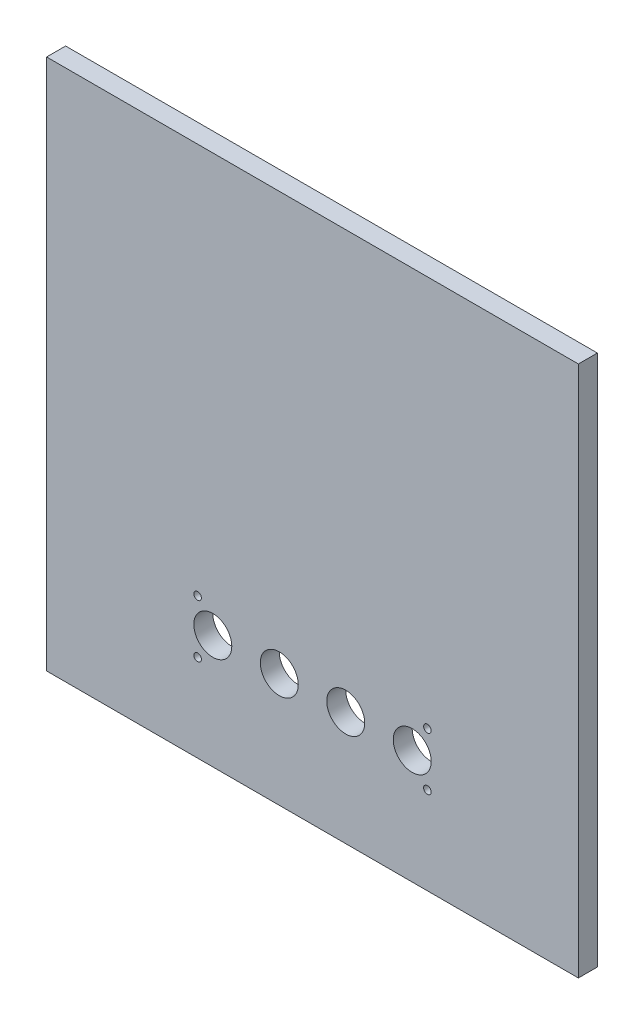
ISO-10303-21;
HEADER;
FILE_DESCRIPTION(('STEP AP214'),'2;1');
FILE_NAME('part.step','',(''),(''),'','','');
FILE_SCHEMA(('AUTOMOTIVE_DESIGN { 1 0 10303 214 1 1 1 1 }'));
ENDSEC;
DATA;
#1=APPLICATION_CONTEXT('core data for automotive mechanical design processes');
#2=APPLICATION_PROTOCOL_DEFINITION('international standard','automotive_design',2000,#1);
#3=PRODUCT_CONTEXT('',#1,'mechanical');
#4=PRODUCT('Part','Part','',(#3));
#5=PRODUCT_RELATED_PRODUCT_CATEGORY('part','',(#4));
#6=PRODUCT_DEFINITION_FORMATION('','',#4);
#7=PRODUCT_DEFINITION_CONTEXT('part definition',#1,'design');
#8=PRODUCT_DEFINITION('design','',#6,#7);
#9=PRODUCT_DEFINITION_SHAPE('','',#8);
#10=(LENGTH_UNIT() NAMED_UNIT(*) SI_UNIT(.MILLI.,.METRE.));
#11=(NAMED_UNIT(*) PLANE_ANGLE_UNIT() SI_UNIT($,.RADIAN.));
#12=(NAMED_UNIT(*) SI_UNIT($,.STERADIAN.) SOLID_ANGLE_UNIT());
#13=UNCERTAINTY_MEASURE_WITH_UNIT(LENGTH_MEASURE(1.E-05),#10,'distance_accuracy_value','');
#14=(GEOMETRIC_REPRESENTATION_CONTEXT(3) GLOBAL_UNCERTAINTY_ASSIGNED_CONTEXT((#13)) GLOBAL_UNIT_ASSIGNED_CONTEXT((#10,
#11,#12)) REPRESENTATION_CONTEXT('',''));
#15=CARTESIAN_POINT('',(0.,0.,0.));
#16=DIRECTION('',(0.,0.,1.));
#17=DIRECTION('',(1.,0.,0.));
#18=AXIS2_PLACEMENT_3D('',#15,#16,#17);
#19=CARTESIAN_POINT('',(30.9345128455401,0.,5.));
#20=DIRECTION('',(1.,0.,0.));
#21=DIRECTION('',(0.,1.,0.));
#22=AXIS2_PLACEMENT_3D('',#19,#20,#21);
#23=PLANE('',#22);
#24=DIRECTION('',(0.,-1.,0.));
#25=VECTOR('',#24,1.);
#26=CARTESIAN_POINT('',(30.9345128455401,0.,0.));
#27=LINE('',#26,#25);
#28=CARTESIAN_POINT('',(30.9345128455401,43.8550194956719,0.));
#29=VERTEX_POINT('',#28);
#30=CARTESIAN_POINT('',(30.9345128455401,-96.1449805043282,0.));
#31=VERTEX_POINT('',#30);
#32=EDGE_CURVE('E98',#29,#31,#27,.T.);
#33=ORIENTED_EDGE('',*,*,#32,.F.);
#34=DIRECTION('',(0.,0.,-1.));
#35=VECTOR('',#34,1.);
#36=CARTESIAN_POINT('',(30.9345128455401,43.8550194956719,5.));
#37=LINE('',#36,#35);
#38=CARTESIAN_POINT('',(30.9345128455401,43.8550194956719,5.));
#39=VERTEX_POINT('',#38);
#40=EDGE_CURVE('E11',#39,#29,#37,.T.);
#41=ORIENTED_EDGE('',*,*,#40,.F.);
#42=DIRECTION('',(0.,-1.,0.));
#43=VECTOR('',#42,1.);
#44=CARTESIAN_POINT('',(30.9345128455401,0.,5.));
#45=LINE('',#44,#43);
#46=CARTESIAN_POINT('',(30.9345128455401,-96.1449805043282,5.));
#47=VERTEX_POINT('',#46);
#48=EDGE_CURVE('E91',#39,#47,#45,.T.);
#49=ORIENTED_EDGE('',*,*,#48,.T.);
#50=DIRECTION('',(0.,0.,-1.));
#51=VECTOR('',#50,1.);
#52=CARTESIAN_POINT('',(30.9345128455401,-96.1449805043282,5.));
#53=LINE('',#52,#51);
#54=EDGE_CURVE('E71',#47,#31,#53,.T.);
#55=ORIENTED_EDGE('',*,*,#54,.T.);
#56=EDGE_LOOP('',(#33,#41,#49,#55));
#57=FACE_BOUND('',#56,.T.);
#58=ADVANCED_FACE('F33',(#57),#23,.T.);
#59=CARTESIAN_POINT('',(0.,43.8550194956719,5.));
#60=DIRECTION('',(0.,1.,0.));
#61=DIRECTION('',(-1.,0.,0.));
#62=AXIS2_PLACEMENT_3D('',#59,#60,#61);
#63=PLANE('',#62);
#64=DIRECTION('',(1.,0.,0.));
#65=VECTOR('',#64,1.);
#66=CARTESIAN_POINT('',(0.,43.8550194956719,0.));
#67=LINE('',#66,#65);
#68=CARTESIAN_POINT('',(-109.06548715446,43.8550194956719,0.));
#69=VERTEX_POINT('',#68);
#70=EDGE_CURVE('E84',#69,#29,#67,.T.);
#71=ORIENTED_EDGE('',*,*,#70,.F.);
#72=DIRECTION('',(0.,0.,-1.));
#73=VECTOR('',#72,1.);
#74=CARTESIAN_POINT('',(-109.06548715446,43.8550194956719,5.));
#75=LINE('',#74,#73);
#76=CARTESIAN_POINT('',(-109.06548715446,43.8550194956719,5.));
#77=VERTEX_POINT('',#76);
#78=EDGE_CURVE('E41',#77,#69,#75,.T.);
#79=ORIENTED_EDGE('',*,*,#78,.F.);
#80=DIRECTION('',(1.,0.,0.));
#81=VECTOR('',#80,1.);
#82=CARTESIAN_POINT('',(0.,43.8550194956719,5.));
#83=LINE('',#82,#81);
#84=EDGE_CURVE('E82',#77,#39,#83,.T.);
#85=ORIENTED_EDGE('',*,*,#84,.T.);
#86=ORIENTED_EDGE('',*,*,#40,.T.);
#87=EDGE_LOOP('',(#71,#79,#85,#86));
#88=FACE_BOUND('',#87,.T.);
#89=ADVANCED_FACE('F80',(#88),#63,.T.);
#90=CARTESIAN_POINT('',(-109.06548715446,0.,5.));
#91=DIRECTION('',(1.,0.,0.));
#92=DIRECTION('',(0.,1.,0.));
#93=AXIS2_PLACEMENT_3D('',#90,#91,#92);
#94=PLANE('',#93);
#95=DIRECTION('',(0.,-1.,0.));
#96=VECTOR('',#95,1.);
#97=CARTESIAN_POINT('',(-109.06548715446,0.,0.));
#98=LINE('',#97,#96);
#99=CARTESIAN_POINT('',(-109.06548715446,-96.1449805043282,0.));
#100=VERTEX_POINT('',#99);
#101=EDGE_CURVE('E64',#69,#100,#98,.T.);
#102=ORIENTED_EDGE('',*,*,#101,.T.);
#103=DIRECTION('',(0.,0.,-1.));
#104=VECTOR('',#103,1.);
#105=CARTESIAN_POINT('',(-109.06548715446,-96.1449805043282,5.));
#106=LINE('',#105,#104);
#107=CARTESIAN_POINT('',(-109.06548715446,-96.1449805043282,5.));
#108=VERTEX_POINT('',#107);
#109=EDGE_CURVE('E85',#108,#100,#106,.T.);
#110=ORIENTED_EDGE('',*,*,#109,.F.);
#111=DIRECTION('',(0.,-1.,0.));
#112=VECTOR('',#111,1.);
#113=CARTESIAN_POINT('',(-109.06548715446,0.,5.));
#114=LINE('',#113,#112);
#115=EDGE_CURVE('E86',#77,#108,#114,.T.);
#116=ORIENTED_EDGE('',*,*,#115,.F.);
#117=ORIENTED_EDGE('',*,*,#78,.T.);
#118=EDGE_LOOP('',(#102,#110,#116,#117));
#119=FACE_BOUND('',#118,.T.);
#120=ADVANCED_FACE('F87',(#119),#94,.F.);
#121=CARTESIAN_POINT('',(0.,-96.1449805043282,5.));
#122=DIRECTION('',(0.,1.,0.));
#123=DIRECTION('',(0.,0.,1.));
#124=AXIS2_PLACEMENT_3D('',#121,#122,#123);
#125=PLANE('',#124);
#126=DIRECTION('',(1.,0.,0.));
#127=VECTOR('',#126,1.);
#128=CARTESIAN_POINT('',(0.,-96.1449805043282,0.));
#129=LINE('',#128,#127);
#130=EDGE_CURVE('E93',#100,#31,#129,.T.);
#131=ORIENTED_EDGE('',*,*,#130,.T.);
#132=ORIENTED_EDGE('',*,*,#54,.F.);
#133=DIRECTION('',(1.,0.,0.));
#134=VECTOR('',#133,1.);
#135=CARTESIAN_POINT('',(0.,-96.1449805043282,5.));
#136=LINE('',#135,#134);
#137=EDGE_CURVE('E49',#108,#47,#136,.T.);
#138=ORIENTED_EDGE('',*,*,#137,.F.);
#139=ORIENTED_EDGE('',*,*,#109,.T.);
#140=EDGE_LOOP('',(#131,#132,#138,#139));
#141=FACE_BOUND('',#140,.T.);
#142=ADVANCED_FACE('F108',(#141),#125,.F.);
#143=CARTESIAN_POINT('',(0.,0.,5.));
#144=DIRECTION('',(0.,0.,1.));
#145=DIRECTION('',(1.,0.,0.));
#146=AXIS2_PLACEMENT_3D('',#143,#144,#145);
#147=PLANE('',#146);
#148=ORIENTED_EDGE('',*,*,#48,.F.);
#149=ORIENTED_EDGE('',*,*,#84,.F.);
#150=ORIENTED_EDGE('',*,*,#115,.T.);
#151=ORIENTED_EDGE('',*,*,#137,.T.);
#152=EDGE_LOOP('',(#148,#149,#150,#151));
#153=FACE_BOUND('',#152,.T.);
#154=CARTESIAN_POINT('',(-65.3154871544599,-66.1449805043282,5.));
#155=DIRECTION('',(0.,0.,1.));
#156=DIRECTION('',(1.,0.,0.));
#157=AXIS2_PLACEMENT_3D('',#154,#155,#156);
#158=CIRCLE('',#157,5.00000000000001);
#159=CARTESIAN_POINT('',(-60.3154871544599,-66.1449805043282,5.));
#160=VERTEX_POINT('',#159);
#161=EDGE_CURVE('E101',#160,#160,#158,.T.);
#162=ORIENTED_EDGE('',*,*,#161,.F.);
#163=EDGE_LOOP('',(#162));
#164=FACE_BOUND('',#163,.T.);
#165=CARTESIAN_POINT('',(-47.8154871544599,-66.1449805043282,5.));
#166=DIRECTION('',(0.,0.,1.));
#167=DIRECTION('',(1.,0.,0.));
#168=AXIS2_PLACEMENT_3D('',#165,#166,#167);
#169=CIRCLE('',#168,5.00000000000001);
#170=CARTESIAN_POINT('',(-42.8154871544599,-66.1449805043282,5.));
#171=VERTEX_POINT('',#170);
#172=EDGE_CURVE('E193',#171,#171,#169,.T.);
#173=ORIENTED_EDGE('',*,*,#172,.F.);
#174=EDGE_LOOP('',(#173));
#175=FACE_BOUND('',#174,.T.);
#176=CARTESIAN_POINT('',(-30.3154871544599,-66.1449805043282,5.));
#177=DIRECTION('',(0.,0.,1.));
#178=DIRECTION('',(1.,0.,0.));
#179=AXIS2_PLACEMENT_3D('',#176,#177,#178);
#180=CIRCLE('',#179,5.00000000000001);
#181=CARTESIAN_POINT('',(-25.3154871544599,-66.1449805043282,5.));
#182=VERTEX_POINT('',#181);
#183=EDGE_CURVE('E196',#182,#182,#180,.T.);
#184=ORIENTED_EDGE('',*,*,#183,.F.);
#185=EDGE_LOOP('',(#184));
#186=FACE_BOUND('',#185,.T.);
#187=CARTESIAN_POINT('',(-12.8154871544599,-66.1449805043282,5.));
#188=DIRECTION('',(0.,0.,1.));
#189=DIRECTION('',(1.,0.,0.));
#190=AXIS2_PLACEMENT_3D('',#187,#188,#189);
#191=CIRCLE('',#190,5.00000000000001);
#192=CARTESIAN_POINT('',(-7.81548715445991,-66.1449805043282,5.));
#193=VERTEX_POINT('',#192);
#194=EDGE_CURVE('E199',#193,#193,#191,.T.);
#195=ORIENTED_EDGE('',*,*,#194,.F.);
#196=EDGE_LOOP('',(#195));
#197=FACE_BOUND('',#196,.T.);
#198=CARTESIAN_POINT('',(-8.81548715445992,-73.1449805043281,5.));
#199=DIRECTION('',(0.,0.,1.));
#200=DIRECTION('',(1.,0.,0.));
#201=AXIS2_PLACEMENT_3D('',#198,#199,#200);
#202=CIRCLE('',#201,1.);
#203=CARTESIAN_POINT('',(-7.81548715445992,-73.1449805043281,5.));
#204=VERTEX_POINT('',#203);
#205=EDGE_CURVE('E202',#204,#204,#202,.T.);
#206=ORIENTED_EDGE('',*,*,#205,.F.);
#207=EDGE_LOOP('',(#206));
#208=FACE_BOUND('',#207,.T.);
#209=CARTESIAN_POINT('',(-69.3154871544599,-73.1449805043286,5.));
#210=DIRECTION('',(0.,0.,1.));
#211=DIRECTION('',(1.,0.,0.));
#212=AXIS2_PLACEMENT_3D('',#209,#210,#211);
#213=CIRCLE('',#212,0.999999999999998);
#214=CARTESIAN_POINT('',(-68.3154871544599,-73.1449805043286,5.));
#215=VERTEX_POINT('',#214);
#216=EDGE_CURVE('E205',#215,#215,#213,.T.);
#217=ORIENTED_EDGE('',*,*,#216,.F.);
#218=EDGE_LOOP('',(#217));
#219=FACE_BOUND('',#218,.T.);
#220=CARTESIAN_POINT('',(-69.31548715446,-59.1449805043286,5.));
#221=DIRECTION('',(0.,0.,1.));
#222=DIRECTION('',(1.,0.,0.));
#223=AXIS2_PLACEMENT_3D('',#220,#221,#222);
#224=CIRCLE('',#223,0.999999999999998);
#225=CARTESIAN_POINT('',(-68.31548715446,-59.1449805043286,5.));
#226=VERTEX_POINT('',#225);
#227=EDGE_CURVE('E169',#226,#226,#224,.T.);
#228=ORIENTED_EDGE('',*,*,#227,.F.);
#229=EDGE_LOOP('',(#228));
#230=FACE_BOUND('',#229,.T.);
#231=CARTESIAN_POINT('',(-8.81548715445997,-59.1449805043281,5.));
#232=DIRECTION('',(0.,0.,1.));
#233=DIRECTION('',(1.,0.,0.));
#234=AXIS2_PLACEMENT_3D('',#231,#232,#233);
#235=CIRCLE('',#234,1.);
#236=CARTESIAN_POINT('',(-7.81548715445996,-59.1449805043281,5.));
#237=VERTEX_POINT('',#236);
#238=EDGE_CURVE('E166',#237,#237,#235,.T.);
#239=ORIENTED_EDGE('',*,*,#238,.F.);
#240=EDGE_LOOP('',(#239));
#241=FACE_BOUND('',#240,.T.);
#242=ADVANCED_FACE('F89',(#153,#164,#175,#186,#197,#208,#219,#230,#241),#147,.T.);
#243=CARTESIAN_POINT('',(0.,0.,0.));
#244=DIRECTION('',(0.,0.,1.));
#245=DIRECTION('',(1.,0.,0.));
#246=AXIS2_PLACEMENT_3D('',#243,#244,#245);
#247=PLANE('',#246);
#248=ORIENTED_EDGE('',*,*,#32,.T.);
#249=ORIENTED_EDGE('',*,*,#130,.F.);
#250=ORIENTED_EDGE('',*,*,#101,.F.);
#251=ORIENTED_EDGE('',*,*,#70,.T.);
#252=EDGE_LOOP('',(#248,#249,#250,#251));
#253=FACE_BOUND('',#252,.T.);
#254=CARTESIAN_POINT('',(-65.3154871544599,-66.1449805043282,0.));
#255=DIRECTION('',(0.,0.,1.));
#256=DIRECTION('',(1.,0.,0.));
#257=AXIS2_PLACEMENT_3D('',#254,#255,#256);
#258=CIRCLE('',#257,5.00000000000001);
#259=CARTESIAN_POINT('',(-60.3154871544599,-66.1449805043282,0.));
#260=VERTEX_POINT('',#259);
#261=EDGE_CURVE('E165',#260,#260,#258,.T.);
#262=ORIENTED_EDGE('',*,*,#261,.T.);
#263=EDGE_LOOP('',(#262));
#264=FACE_BOUND('',#263,.T.);
#265=CARTESIAN_POINT('',(-47.8154871544599,-66.1449805043282,0.));
#266=DIRECTION('',(0.,0.,1.));
#267=DIRECTION('',(1.,0.,0.));
#268=AXIS2_PLACEMENT_3D('',#265,#266,#267);
#269=CIRCLE('',#268,5.00000000000001);
#270=CARTESIAN_POINT('',(-42.8154871544599,-66.1449805043282,0.));
#271=VERTEX_POINT('',#270);
#272=EDGE_CURVE('E167',#271,#271,#269,.T.);
#273=ORIENTED_EDGE('',*,*,#272,.T.);
#274=EDGE_LOOP('',(#273));
#275=FACE_BOUND('',#274,.T.);
#276=CARTESIAN_POINT('',(-30.3154871544599,-66.1449805043282,0.));
#277=DIRECTION('',(0.,0.,1.));
#278=DIRECTION('',(1.,0.,0.));
#279=AXIS2_PLACEMENT_3D('',#276,#277,#278);
#280=CIRCLE('',#279,5.00000000000001);
#281=CARTESIAN_POINT('',(-25.3154871544599,-66.1449805043282,0.));
#282=VERTEX_POINT('',#281);
#283=EDGE_CURVE('E172',#282,#282,#280,.T.);
#284=ORIENTED_EDGE('',*,*,#283,.T.);
#285=EDGE_LOOP('',(#284));
#286=FACE_BOUND('',#285,.T.);
#287=CARTESIAN_POINT('',(-12.8154871544599,-66.1449805043282,0.));
#288=DIRECTION('',(0.,0.,1.));
#289=DIRECTION('',(1.,0.,0.));
#290=AXIS2_PLACEMENT_3D('',#287,#288,#289);
#291=CIRCLE('',#290,5.00000000000001);
#292=CARTESIAN_POINT('',(-7.81548715445991,-66.1449805043282,0.));
#293=VERTEX_POINT('',#292);
#294=EDGE_CURVE('E177',#293,#293,#291,.T.);
#295=ORIENTED_EDGE('',*,*,#294,.T.);
#296=EDGE_LOOP('',(#295));
#297=FACE_BOUND('',#296,.T.);
#298=CARTESIAN_POINT('',(-8.81548715445992,-73.1449805043281,0.));
#299=DIRECTION('',(0.,0.,1.));
#300=DIRECTION('',(1.,0.,0.));
#301=AXIS2_PLACEMENT_3D('',#298,#299,#300);
#302=CIRCLE('',#301,1.);
#303=CARTESIAN_POINT('',(-7.81548715445992,-73.1449805043281,0.));
#304=VERTEX_POINT('',#303);
#305=EDGE_CURVE('E180',#304,#304,#302,.T.);
#306=ORIENTED_EDGE('',*,*,#305,.T.);
#307=EDGE_LOOP('',(#306));
#308=FACE_BOUND('',#307,.T.);
#309=CARTESIAN_POINT('',(-69.3154871544599,-73.1449805043286,0.));
#310=DIRECTION('',(0.,0.,1.));
#311=DIRECTION('',(1.,0.,0.));
#312=AXIS2_PLACEMENT_3D('',#309,#310,#311);
#313=CIRCLE('',#312,0.999999999999998);
#314=CARTESIAN_POINT('',(-68.3154871544599,-73.1449805043286,0.));
#315=VERTEX_POINT('',#314);
#316=EDGE_CURVE('E183',#315,#315,#313,.T.);
#317=ORIENTED_EDGE('',*,*,#316,.T.);
#318=EDGE_LOOP('',(#317));
#319=FACE_BOUND('',#318,.T.);
#320=CARTESIAN_POINT('',(-69.31548715446,-59.1449805043286,0.));
#321=DIRECTION('',(0.,0.,1.));
#322=DIRECTION('',(1.,0.,0.));
#323=AXIS2_PLACEMENT_3D('',#320,#321,#322);
#324=CIRCLE('',#323,0.999999999999998);
#325=CARTESIAN_POINT('',(-68.31548715446,-59.1449805043286,0.));
#326=VERTEX_POINT('',#325);
#327=EDGE_CURVE('E186',#326,#326,#324,.T.);
#328=ORIENTED_EDGE('',*,*,#327,.T.);
#329=EDGE_LOOP('',(#328));
#330=FACE_BOUND('',#329,.T.);
#331=CARTESIAN_POINT('',(-8.81548715445997,-59.1449805043281,0.));
#332=DIRECTION('',(0.,0.,1.));
#333=DIRECTION('',(1.,0.,0.));
#334=AXIS2_PLACEMENT_3D('',#331,#332,#333);
#335=CIRCLE('',#334,1.);
#336=CARTESIAN_POINT('',(-7.81548715445996,-59.1449805043281,0.));
#337=VERTEX_POINT('',#336);
#338=EDGE_CURVE('E189',#337,#337,#335,.T.);
#339=ORIENTED_EDGE('',*,*,#338,.T.);
#340=EDGE_LOOP('',(#339));
#341=FACE_BOUND('',#340,.T.);
#342=ADVANCED_FACE('F110',(#253,#264,#275,#286,#297,#308,#319,#330,#341),#247,.F.);
#343=CARTESIAN_POINT('',(-65.3154871544599,-66.1449805043282,5.));
#344=DIRECTION('',(0.,0.,-1.));
#345=DIRECTION('',(-1.,0.,0.));
#346=AXIS2_PLACEMENT_3D('',#343,#344,#345);
#347=CYLINDRICAL_SURFACE('',#346,5.00000000000001);
#348=ORIENTED_EDGE('',*,*,#161,.T.);
#349=EDGE_LOOP('',(#348));
#350=FACE_BOUND('',#349,.T.);
#351=ORIENTED_EDGE('',*,*,#261,.F.);
#352=EDGE_LOOP('',(#351));
#353=FACE_BOUND('',#352,.T.);
#354=ADVANCED_FACE('F125',(#350,#353),#347,.F.);
#355=CARTESIAN_POINT('',(-47.8154871544599,-66.1449805043282,5.));
#356=DIRECTION('',(0.,0.,-1.));
#357=DIRECTION('',(-1.,0.,0.));
#358=AXIS2_PLACEMENT_3D('',#355,#356,#357);
#359=CYLINDRICAL_SURFACE('',#358,5.00000000000001);
#360=ORIENTED_EDGE('',*,*,#172,.T.);
#361=EDGE_LOOP('',(#360));
#362=FACE_BOUND('',#361,.T.);
#363=ORIENTED_EDGE('',*,*,#272,.F.);
#364=EDGE_LOOP('',(#363));
#365=FACE_BOUND('',#364,.T.);
#366=ADVANCED_FACE('F151',(#362,#365),#359,.F.);
#367=CARTESIAN_POINT('',(-30.3154871544599,-66.1449805043282,5.));
#368=DIRECTION('',(0.,0.,-1.));
#369=DIRECTION('',(-1.,0.,0.));
#370=AXIS2_PLACEMENT_3D('',#367,#368,#369);
#371=CYLINDRICAL_SURFACE('',#370,5.00000000000001);
#372=ORIENTED_EDGE('',*,*,#183,.T.);
#373=EDGE_LOOP('',(#372));
#374=FACE_BOUND('',#373,.T.);
#375=ORIENTED_EDGE('',*,*,#283,.F.);
#376=EDGE_LOOP('',(#375));
#377=FACE_BOUND('',#376,.T.);
#378=ADVANCED_FACE('F147',(#374,#377),#371,.F.);
#379=CARTESIAN_POINT('',(-12.8154871544599,-66.1449805043282,5.));
#380=DIRECTION('',(0.,0.,-1.));
#381=DIRECTION('',(-1.,0.,0.));
#382=AXIS2_PLACEMENT_3D('',#379,#380,#381);
#383=CYLINDRICAL_SURFACE('',#382,5.00000000000001);
#384=ORIENTED_EDGE('',*,*,#194,.T.);
#385=EDGE_LOOP('',(#384));
#386=FACE_BOUND('',#385,.T.);
#387=ORIENTED_EDGE('',*,*,#294,.F.);
#388=EDGE_LOOP('',(#387));
#389=FACE_BOUND('',#388,.T.);
#390=ADVANCED_FACE('F143',(#386,#389),#383,.F.);
#391=CARTESIAN_POINT('',(-8.81548715445992,-73.1449805043281,5.));
#392=DIRECTION('',(0.,0.,-1.));
#393=DIRECTION('',(-1.,0.,0.));
#394=AXIS2_PLACEMENT_3D('',#391,#392,#393);
#395=CYLINDRICAL_SURFACE('',#394,1.);
#396=ORIENTED_EDGE('',*,*,#205,.T.);
#397=EDGE_LOOP('',(#396));
#398=FACE_BOUND('',#397,.T.);
#399=ORIENTED_EDGE('',*,*,#305,.F.);
#400=EDGE_LOOP('',(#399));
#401=FACE_BOUND('',#400,.T.);
#402=ADVANCED_FACE('F139',(#398,#401),#395,.F.);
#403=CARTESIAN_POINT('',(-69.3154871544599,-73.1449805043286,5.));
#404=DIRECTION('',(0.,0.,-1.));
#405=DIRECTION('',(-1.,0.,0.));
#406=AXIS2_PLACEMENT_3D('',#403,#404,#405);
#407=CYLINDRICAL_SURFACE('',#406,0.999999999999998);
#408=ORIENTED_EDGE('',*,*,#216,.T.);
#409=EDGE_LOOP('',(#408));
#410=FACE_BOUND('',#409,.T.);
#411=ORIENTED_EDGE('',*,*,#316,.F.);
#412=EDGE_LOOP('',(#411));
#413=FACE_BOUND('',#412,.T.);
#414=ADVANCED_FACE('F135',(#410,#413),#407,.F.);
#415=CARTESIAN_POINT('',(-69.31548715446,-59.1449805043286,5.));
#416=DIRECTION('',(0.,0.,-1.));
#417=DIRECTION('',(-1.,0.,0.));
#418=AXIS2_PLACEMENT_3D('',#415,#416,#417);
#419=CYLINDRICAL_SURFACE('',#418,0.999999999999998);
#420=ORIENTED_EDGE('',*,*,#227,.T.);
#421=EDGE_LOOP('',(#420));
#422=FACE_BOUND('',#421,.T.);
#423=ORIENTED_EDGE('',*,*,#327,.F.);
#424=EDGE_LOOP('',(#423));
#425=FACE_BOUND('',#424,.T.);
#426=ADVANCED_FACE('F131',(#422,#425),#419,.F.);
#427=CARTESIAN_POINT('',(-8.81548715445997,-59.1449805043281,5.));
#428=DIRECTION('',(0.,0.,-1.));
#429=DIRECTION('',(-1.,0.,0.));
#430=AXIS2_PLACEMENT_3D('',#427,#428,#429);
#431=CYLINDRICAL_SURFACE('',#430,1.);
#432=ORIENTED_EDGE('',*,*,#238,.T.);
#433=EDGE_LOOP('',(#432));
#434=FACE_BOUND('',#433,.T.);
#435=ORIENTED_EDGE('',*,*,#338,.F.);
#436=EDGE_LOOP('',(#435));
#437=FACE_BOUND('',#436,.T.);
#438=ADVANCED_FACE('F128',(#434,#437),#431,.F.);
#439=CLOSED_SHELL('',(#58,#89,#120,#142,#242,#342,#354,#366,#378,#390,#402,#414,#426,#438));
#440=MANIFOLD_SOLID_BREP('B2',#439);
#441=ADVANCED_BREP_SHAPE_REPRESENTATION('',(#18,#440),#14);
#442=SHAPE_DEFINITION_REPRESENTATION(#9,#441);
ENDSEC;
END-ISO-10303-21;
